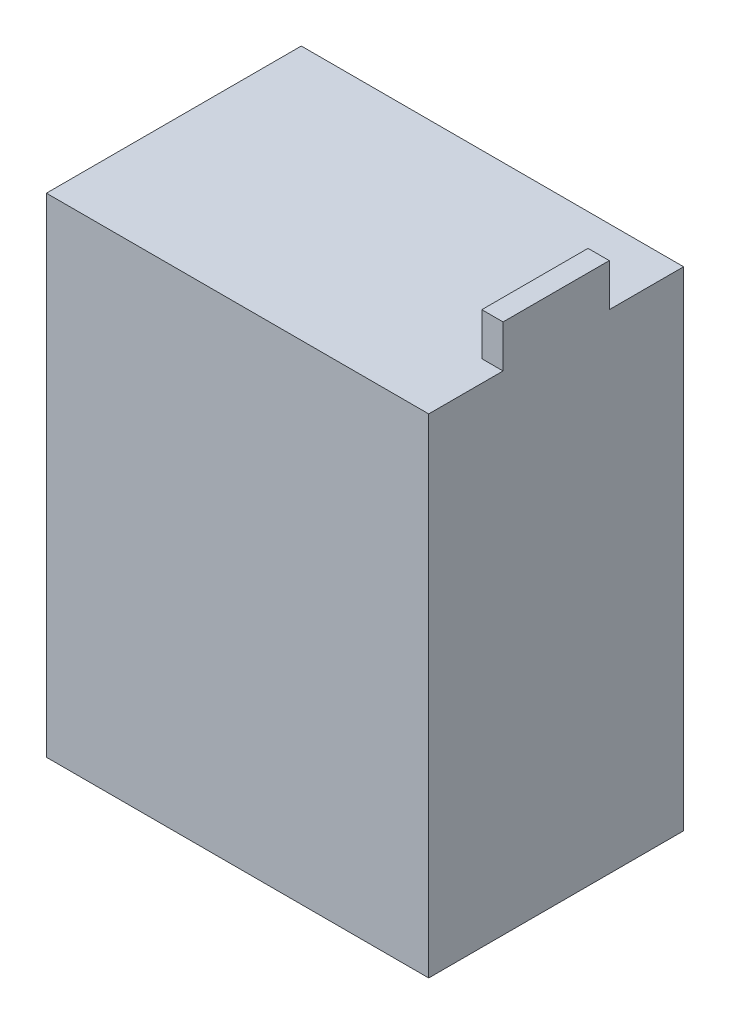
ISO-10303-21;
HEADER;
FILE_DESCRIPTION(('STEP AP214'),'2;1');
FILE_NAME('part.step','',(''),(''),'','','');
FILE_SCHEMA(('AUTOMOTIVE_DESIGN { 1 0 10303 214 1 1 1 1 }'));
ENDSEC;
DATA;
#1=APPLICATION_CONTEXT('core data for automotive mechanical design processes');
#2=APPLICATION_PROTOCOL_DEFINITION('international standard','automotive_design',2000,#1);
#3=PRODUCT_CONTEXT('',#1,'mechanical');
#4=PRODUCT('Part','Part','',(#3));
#5=PRODUCT_RELATED_PRODUCT_CATEGORY('part','',(#4));
#6=PRODUCT_DEFINITION_FORMATION('','',#4);
#7=PRODUCT_DEFINITION_CONTEXT('part definition',#1,'design');
#8=PRODUCT_DEFINITION('design','',#6,#7);
#9=PRODUCT_DEFINITION_SHAPE('','',#8);
#10=(LENGTH_UNIT() NAMED_UNIT(*) SI_UNIT(.MILLI.,.METRE.));
#11=(NAMED_UNIT(*) PLANE_ANGLE_UNIT() SI_UNIT($,.RADIAN.));
#12=(NAMED_UNIT(*) SI_UNIT($,.STERADIAN.) SOLID_ANGLE_UNIT());
#13=UNCERTAINTY_MEASURE_WITH_UNIT(LENGTH_MEASURE(1.E-05),#10,'distance_accuracy_value','');
#14=(GEOMETRIC_REPRESENTATION_CONTEXT(3) GLOBAL_UNCERTAINTY_ASSIGNED_CONTEXT((#13)) GLOBAL_UNIT_ASSIGNED_CONTEXT((#10,
#11,#12)) REPRESENTATION_CONTEXT('',''));
#15=CARTESIAN_POINT('',(0.,0.,0.));
#16=DIRECTION('',(0.,0.,1.));
#17=DIRECTION('',(1.,0.,0.));
#18=AXIS2_PLACEMENT_3D('',#15,#16,#17);
#19=CARTESIAN_POINT('',(17.502862930298,-463.1250610351,6.));
#20=DIRECTION('',(0.,-1.,0.));
#21=DIRECTION('',(-1.,0.,0.));
#22=AXIS2_PLACEMENT_3D('',#19,#20,#21);
#23=PLANE('',#22);
#24=DIRECTION('',(0.,0.,-1.));
#25=VECTOR('',#24,1.);
#26=CARTESIAN_POINT('',(8.502862930298,-463.1250610351,12.));
#27=LINE('',#26,#25);
#28=CARTESIAN_POINT('',(8.502862930298,-463.1250610351,12.));
#29=VERTEX_POINT('',#28);
#30=CARTESIAN_POINT('',(8.502862930298,-463.1250610351,0.));
#31=VERTEX_POINT('',#30);
#32=EDGE_CURVE('E10',#29,#31,#27,.T.);
#33=ORIENTED_EDGE('',*,*,#32,.T.);
#34=DIRECTION('',(1.,0.,0.));
#35=VECTOR('',#34,1.);
#36=CARTESIAN_POINT('',(8.502862930298,-463.1250610351,0.));
#37=LINE('',#36,#35);
#38=CARTESIAN_POINT('',(26.502862930298,-463.1250610351,0.));
#39=VERTEX_POINT('',#38);
#40=EDGE_CURVE('E26',#31,#39,#37,.T.);
#41=ORIENTED_EDGE('',*,*,#40,.T.);
#42=DIRECTION('',(0.,0.,1.));
#43=VECTOR('',#42,1.);
#44=CARTESIAN_POINT('',(26.502862930298,-463.1250610351,0.));
#45=LINE('',#44,#43);
#46=CARTESIAN_POINT('',(26.502862930298,-463.1250610351,12.));
#47=VERTEX_POINT('',#46);
#48=EDGE_CURVE('E151',#39,#47,#45,.T.);
#49=ORIENTED_EDGE('',*,*,#48,.T.);
#50=DIRECTION('',(-1.,0.,0.));
#51=VECTOR('',#50,1.);
#52=CARTESIAN_POINT('',(26.502862930298,-463.1250610351,12.));
#53=LINE('',#52,#51);
#54=EDGE_CURVE('E153',#47,#29,#53,.T.);
#55=ORIENTED_EDGE('',*,*,#54,.T.);
#56=EDGE_LOOP('',(#33,#41,#49,#55));
#57=FACE_BOUND('',#56,.T.);
#58=ADVANCED_FACE('F15',(#57),#23,.T.);
#59=CARTESIAN_POINT('',(8.502862930298,-451.6250610351,6.));
#60=DIRECTION('',(-1.,0.,0.));
#61=DIRECTION('',(0.,1.,0.));
#62=AXIS2_PLACEMENT_3D('',#59,#60,#61);
#63=PLANE('',#62);
#64=ORIENTED_EDGE('',*,*,#32,.F.);
#65=DIRECTION('',(0.,1.,0.));
#66=VECTOR('',#65,1.);
#67=CARTESIAN_POINT('',(8.502862930298,-463.1250610351,12.));
#68=LINE('',#67,#66);
#69=CARTESIAN_POINT('',(8.502862930298,-440.1250610351,12.));
#70=VERTEX_POINT('',#69);
#71=EDGE_CURVE('E156',#29,#70,#68,.T.);
#72=ORIENTED_EDGE('',*,*,#71,.T.);
#73=DIRECTION('',(0.,0.,-1.));
#74=VECTOR('',#73,1.);
#75=CARTESIAN_POINT('',(8.502862930298,-440.1250610351,12.));
#76=LINE('',#75,#74);
#77=CARTESIAN_POINT('',(8.502862930298,-440.1250610351,0.));
#78=VERTEX_POINT('',#77);
#79=EDGE_CURVE('E184',#70,#78,#76,.T.);
#80=ORIENTED_EDGE('',*,*,#79,.T.);
#81=DIRECTION('',(0.,-1.,0.));
#82=VECTOR('',#81,1.);
#83=CARTESIAN_POINT('',(8.502862930298,-440.1250610351,0.));
#84=LINE('',#83,#82);
#85=EDGE_CURVE('E164',#78,#31,#84,.T.);
#86=ORIENTED_EDGE('',*,*,#85,.T.);
#87=EDGE_LOOP('',(#64,#72,#80,#86));
#88=FACE_BOUND('',#87,.T.);
#89=ADVANCED_FACE('F308',(#88),#63,.T.);
#90=CARTESIAN_POINT('',(17.696411317395,-440.1250610351,6.));
#91=DIRECTION('',(0.,1.,0.));
#92=DIRECTION('',(1.,0.,0.));
#93=AXIS2_PLACEMENT_3D('',#90,#91,#92);
#94=PLANE('',#93);
#95=DIRECTION('',(0.,0.,-1.));
#96=VECTOR('',#95,1.);
#97=CARTESIAN_POINT('',(26.502862930298,-440.1250610351,3.5));
#98=LINE('',#97,#96);
#99=CARTESIAN_POINT('',(26.502862930298,-440.1250610351,3.5));
#100=VERTEX_POINT('',#99);
#101=CARTESIAN_POINT('',(26.502862930298,-440.1250610351,0.));
#102=VERTEX_POINT('',#101);
#103=EDGE_CURVE('E158',#100,#102,#98,.T.);
#104=ORIENTED_EDGE('',*,*,#103,.T.);
#105=DIRECTION('',(-1.,0.,0.));
#106=VECTOR('',#105,1.);
#107=CARTESIAN_POINT('',(26.502862930298,-440.1250610351,0.));
#108=LINE('',#107,#106);
#109=EDGE_CURVE('E96',#102,#78,#108,.T.);
#110=ORIENTED_EDGE('',*,*,#109,.T.);
#111=ORIENTED_EDGE('',*,*,#79,.F.);
#112=DIRECTION('',(1.,0.,0.));
#113=VECTOR('',#112,1.);
#114=CARTESIAN_POINT('',(8.502862930298,-440.1250610351,12.));
#115=LINE('',#114,#113);
#116=CARTESIAN_POINT('',(26.502862930298,-440.1250610351,12.));
#117=VERTEX_POINT('',#116);
#118=EDGE_CURVE('E159',#70,#117,#115,.T.);
#119=ORIENTED_EDGE('',*,*,#118,.T.);
#120=DIRECTION('',(0.,0.,-1.));
#121=VECTOR('',#120,1.);
#122=CARTESIAN_POINT('',(26.502862930298,-440.1250610351,12.));
#123=LINE('',#122,#121);
#124=CARTESIAN_POINT('',(26.502862930298,-440.1250610351,8.5));
#125=VERTEX_POINT('',#124);
#126=EDGE_CURVE('E89',#117,#125,#123,.T.);
#127=ORIENTED_EDGE('',*,*,#126,.T.);
#128=DIRECTION('',(-1.,0.,0.));
#129=VECTOR('',#128,1.);
#130=CARTESIAN_POINT('',(26.502862930298,-440.1250610351,8.5));
#131=LINE('',#130,#129);
#132=CARTESIAN_POINT('',(25.502862930298,-440.1250610351,8.5));
#133=VERTEX_POINT('',#132);
#134=EDGE_CURVE('E172',#125,#133,#131,.T.);
#135=ORIENTED_EDGE('',*,*,#134,.T.);
#136=DIRECTION('',(0.,0.,-1.));
#137=VECTOR('',#136,1.);
#138=CARTESIAN_POINT('',(25.502862930298,-440.1250610351,8.5));
#139=LINE('',#138,#137);
#140=CARTESIAN_POINT('',(25.502862930298,-440.1250610351,3.5));
#141=VERTEX_POINT('',#140);
#142=EDGE_CURVE('E136',#133,#141,#139,.T.);
#143=ORIENTED_EDGE('',*,*,#142,.T.);
#144=DIRECTION('',(1.,0.,0.));
#145=VECTOR('',#144,1.);
#146=CARTESIAN_POINT('',(25.502862930298,-440.1250610351,3.5));
#147=LINE('',#146,#145);
#148=EDGE_CURVE('E57',#141,#100,#147,.T.);
#149=ORIENTED_EDGE('',*,*,#148,.T.);
#150=EDGE_LOOP('',(#104,#110,#111,#119,#127,#135,#143,#149));
#151=FACE_BOUND('',#150,.T.);
#152=ADVANCED_FACE('F300',(#151),#94,.T.);
#153=CARTESIAN_POINT('',(26.002862930298,-439.1250610351,8.5));
#154=DIRECTION('',(0.,0.,1.));
#155=DIRECTION('',(1.,0.,0.));
#156=AXIS2_PLACEMENT_3D('',#153,#154,#155);
#157=PLANE('',#156);
#158=DIRECTION('',(0.,-1.,0.));
#159=VECTOR('',#158,1.);
#160=CARTESIAN_POINT('',(25.502862930298,-438.1250610351,8.5));
#161=LINE('',#160,#159);
#162=CARTESIAN_POINT('',(25.502862930298,-438.1250610351,8.5));
#163=VERTEX_POINT('',#162);
#164=EDGE_CURVE('E125',#163,#133,#161,.T.);
#165=ORIENTED_EDGE('',*,*,#164,.T.);
#166=ORIENTED_EDGE('',*,*,#134,.F.);
#167=DIRECTION('',(0.,1.,0.));
#168=VECTOR('',#167,1.);
#169=CARTESIAN_POINT('',(26.502862930298,-440.1250610351,8.5));
#170=LINE('',#169,#168);
#171=CARTESIAN_POINT('',(26.502862930298,-438.1250610351,8.5));
#172=VERTEX_POINT('',#171);
#173=EDGE_CURVE('E126',#125,#172,#170,.T.);
#174=ORIENTED_EDGE('',*,*,#173,.T.);
#175=DIRECTION('',(-1.,0.,0.));
#176=VECTOR('',#175,1.);
#177=CARTESIAN_POINT('',(26.502862930298,-438.1250610351,8.5));
#178=LINE('',#177,#176);
#179=EDGE_CURVE('E122',#172,#163,#178,.T.);
#180=ORIENTED_EDGE('',*,*,#179,.T.);
#181=EDGE_LOOP('',(#165,#166,#174,#180));
#182=FACE_BOUND('',#181,.T.);
#183=ADVANCED_FACE('F124',(#182),#157,.T.);
#184=CARTESIAN_POINT('',(25.502862930298,-439.1250610351,6.));
#185=DIRECTION('',(-1.,0.,0.));
#186=DIRECTION('',(0.,0.,1.));
#187=AXIS2_PLACEMENT_3D('',#184,#185,#186);
#188=PLANE('',#187);
#189=ORIENTED_EDGE('',*,*,#142,.F.);
#190=ORIENTED_EDGE('',*,*,#164,.F.);
#191=DIRECTION('',(0.,0.,-1.));
#192=VECTOR('',#191,1.);
#193=CARTESIAN_POINT('',(25.502862930298,-438.1250610351,8.5));
#194=LINE('',#193,#192);
#195=CARTESIAN_POINT('',(25.502862930298,-438.1250610351,3.5));
#196=VERTEX_POINT('',#195);
#197=EDGE_CURVE('E131',#163,#196,#194,.T.);
#198=ORIENTED_EDGE('',*,*,#197,.T.);
#199=DIRECTION('',(0.,-1.,0.));
#200=VECTOR('',#199,1.);
#201=CARTESIAN_POINT('',(25.502862930298,-438.1250610351,3.5));
#202=LINE('',#201,#200);
#203=EDGE_CURVE('E114',#196,#141,#202,.T.);
#204=ORIENTED_EDGE('',*,*,#203,.T.);
#205=EDGE_LOOP('',(#189,#190,#198,#204));
#206=FACE_BOUND('',#205,.T.);
#207=ADVANCED_FACE('F134',(#206),#188,.T.);
#208=CARTESIAN_POINT('',(17.502862930298,-451.6250610351,12.));
#209=DIRECTION('',(0.,0.,1.));
#210=DIRECTION('',(1.,0.,0.));
#211=AXIS2_PLACEMENT_3D('',#208,#209,#210);
#212=PLANE('',#211);
#213=ORIENTED_EDGE('',*,*,#71,.F.);
#214=ORIENTED_EDGE('',*,*,#54,.F.);
#215=DIRECTION('',(0.,1.,0.));
#216=VECTOR('',#215,1.);
#217=CARTESIAN_POINT('',(26.502862930298,-463.1250610351,12.));
#218=LINE('',#217,#216);
#219=EDGE_CURVE('E147',#47,#117,#218,.T.);
#220=ORIENTED_EDGE('',*,*,#219,.T.);
#221=ORIENTED_EDGE('',*,*,#118,.F.);
#222=EDGE_LOOP('',(#213,#214,#220,#221));
#223=FACE_BOUND('',#222,.T.);
#224=ADVANCED_FACE('F286',(#223),#212,.T.);
#225=CARTESIAN_POINT('',(26.002862930298,-438.1250610351,6.));
#226=DIRECTION('',(0.,1.,0.));
#227=DIRECTION('',(1.,0.,0.));
#228=AXIS2_PLACEMENT_3D('',#225,#226,#227);
#229=PLANE('',#228);
#230=DIRECTION('',(-1.,0.,0.));
#231=VECTOR('',#230,1.);
#232=CARTESIAN_POINT('',(26.502862930298,-438.1250610351,3.5));
#233=LINE('',#232,#231);
#234=CARTESIAN_POINT('',(26.502862930298,-438.1250610351,3.5));
#235=VERTEX_POINT('',#234);
#236=EDGE_CURVE('E19',#235,#196,#233,.T.);
#237=ORIENTED_EDGE('',*,*,#236,.T.);
#238=ORIENTED_EDGE('',*,*,#197,.F.);
#239=ORIENTED_EDGE('',*,*,#179,.F.);
#240=DIRECTION('',(0.,0.,-1.));
#241=VECTOR('',#240,1.);
#242=CARTESIAN_POINT('',(26.502862930298,-438.1250610351,8.5));
#243=LINE('',#242,#241);
#244=EDGE_CURVE('E181',#172,#235,#243,.T.);
#245=ORIENTED_EDGE('',*,*,#244,.T.);
#246=EDGE_LOOP('',(#237,#238,#239,#245));
#247=FACE_BOUND('',#246,.T.);
#248=ADVANCED_FACE('F140',(#247),#229,.T.);
#249=CARTESIAN_POINT('',(26.002862930298,-439.1250610351,3.5));
#250=DIRECTION('',(0.,0.,-1.));
#251=DIRECTION('',(0.,-1.,0.));
#252=AXIS2_PLACEMENT_3D('',#249,#250,#251);
#253=PLANE('',#252);
#254=ORIENTED_EDGE('',*,*,#203,.F.);
#255=ORIENTED_EDGE('',*,*,#236,.F.);
#256=DIRECTION('',(0.,-1.,0.));
#257=VECTOR('',#256,1.);
#258=CARTESIAN_POINT('',(26.502862930298,-438.1250610351,3.5));
#259=LINE('',#258,#257);
#260=EDGE_CURVE('E179',#235,#100,#259,.T.);
#261=ORIENTED_EDGE('',*,*,#260,.T.);
#262=ORIENTED_EDGE('',*,*,#148,.F.);
#263=EDGE_LOOP('',(#254,#255,#261,#262));
#264=FACE_BOUND('',#263,.T.);
#265=ADVANCED_FACE('F285',(#264),#253,.T.);
#266=CARTESIAN_POINT('',(26.502862930298,-450.8142502243,6.));
#267=DIRECTION('',(1.,0.,0.));
#268=DIRECTION('',(0.,1.,0.));
#269=AXIS2_PLACEMENT_3D('',#266,#267,#268);
#270=PLANE('',#269);
#271=ORIENTED_EDGE('',*,*,#48,.F.);
#272=DIRECTION('',(0.,1.,0.));
#273=VECTOR('',#272,1.);
#274=CARTESIAN_POINT('',(26.502862930298,-463.1250610351,0.));
#275=LINE('',#274,#273);
#276=EDGE_CURVE('E182',#39,#102,#275,.T.);
#277=ORIENTED_EDGE('',*,*,#276,.T.);
#278=ORIENTED_EDGE('',*,*,#103,.F.);
#279=ORIENTED_EDGE('',*,*,#260,.F.);
#280=ORIENTED_EDGE('',*,*,#244,.F.);
#281=ORIENTED_EDGE('',*,*,#173,.F.);
#282=ORIENTED_EDGE('',*,*,#126,.F.);
#283=ORIENTED_EDGE('',*,*,#219,.F.);
#284=EDGE_LOOP('',(#271,#277,#278,#279,#280,#281,#282,#283));
#285=FACE_BOUND('',#284,.T.);
#286=ADVANCED_FACE('F278',(#285),#270,.T.);
#287=CARTESIAN_POINT('',(17.502862930298,-451.6250610351,0.));
#288=DIRECTION('',(0.,0.,-1.));
#289=DIRECTION('',(-1.,0.,0.));
#290=AXIS2_PLACEMENT_3D('',#287,#288,#289);
#291=PLANE('',#290);
#292=ORIENTED_EDGE('',*,*,#40,.F.);
#293=ORIENTED_EDGE('',*,*,#85,.F.);
#294=ORIENTED_EDGE('',*,*,#109,.F.);
#295=ORIENTED_EDGE('',*,*,#276,.F.);
#296=EDGE_LOOP('',(#292,#293,#294,#295));
#297=FACE_BOUND('',#296,.T.);
#298=ADVANCED_FACE('F17',(#297),#291,.T.);
#299=CLOSED_SHELL('',(#58,#89,#152,#183,#207,#224,#248,#265,#286,#298));
#300=MANIFOLD_SOLID_BREP('B1',#299);
#301=ADVANCED_BREP_SHAPE_REPRESENTATION('',(#18,#300),#14);
#302=SHAPE_DEFINITION_REPRESENTATION(#9,#301);
ENDSEC;
END-ISO-10303-21;
